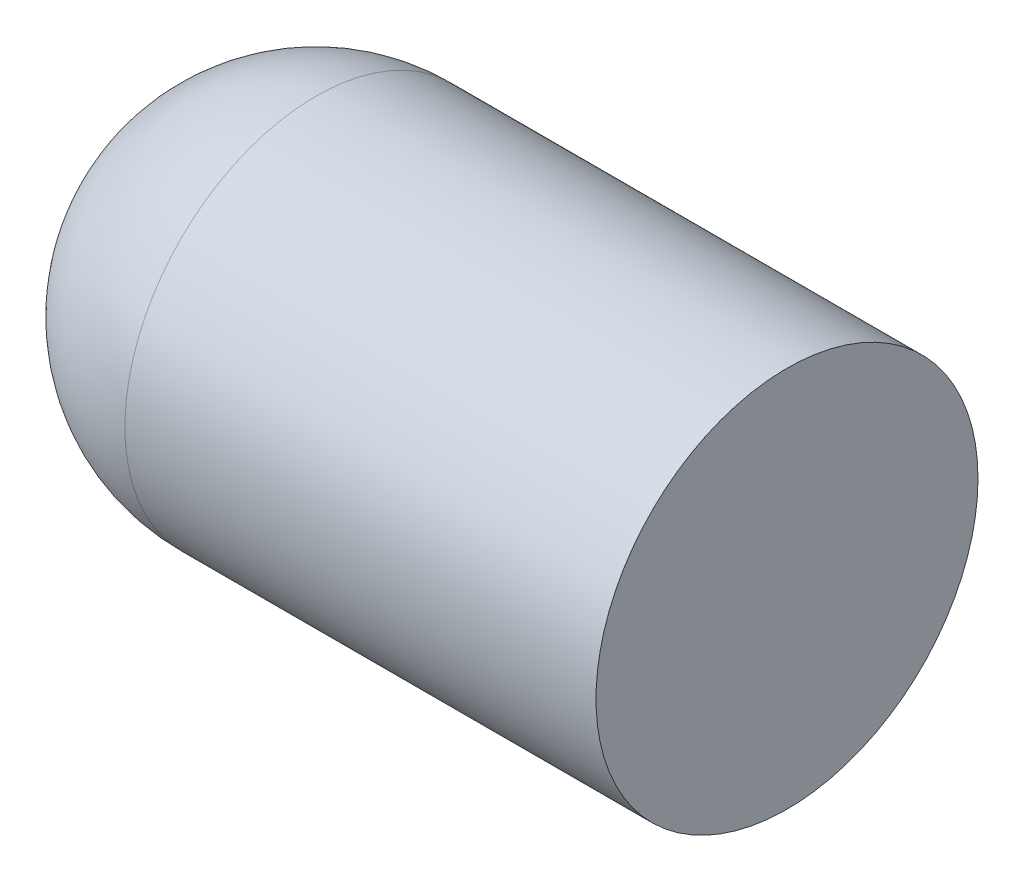
ISO-10303-21;
HEADER;
FILE_DESCRIPTION(('STEP AP214'),'2;1');
FILE_NAME('part.step','',(''),(''),'','','');
FILE_SCHEMA(('AUTOMOTIVE_DESIGN { 1 0 10303 214 1 1 1 1 }'));
ENDSEC;
DATA;
#1=APPLICATION_CONTEXT('core data for automotive mechanical design processes');
#2=APPLICATION_PROTOCOL_DEFINITION('international standard','automotive_design',2000,#1);
#3=PRODUCT_CONTEXT('',#1,'mechanical');
#4=PRODUCT('Part','Part','',(#3));
#5=PRODUCT_RELATED_PRODUCT_CATEGORY('part','',(#4));
#6=PRODUCT_DEFINITION_FORMATION('','',#4);
#7=PRODUCT_DEFINITION_CONTEXT('part definition',#1,'design');
#8=PRODUCT_DEFINITION('design','',#6,#7);
#9=PRODUCT_DEFINITION_SHAPE('','',#8);
#10=(LENGTH_UNIT() NAMED_UNIT(*) SI_UNIT(.MILLI.,.METRE.));
#11=(NAMED_UNIT(*) PLANE_ANGLE_UNIT() SI_UNIT($,.RADIAN.));
#12=(NAMED_UNIT(*) SI_UNIT($,.STERADIAN.) SOLID_ANGLE_UNIT());
#13=UNCERTAINTY_MEASURE_WITH_UNIT(LENGTH_MEASURE(1.E-05),#10,'distance_accuracy_value','');
#14=(GEOMETRIC_REPRESENTATION_CONTEXT(3) GLOBAL_UNCERTAINTY_ASSIGNED_CONTEXT((#13)) GLOBAL_UNIT_ASSIGNED_CONTEXT((#10,
#11,#12)) REPRESENTATION_CONTEXT('',''));
#15=CARTESIAN_POINT('',(0.,0.,0.));
#16=DIRECTION('',(0.,0.,1.));
#17=DIRECTION('',(1.,0.,0.));
#18=AXIS2_PLACEMENT_3D('',#15,#16,#17);
#19=CARTESIAN_POINT('',(3.7,0.,0.));
#20=DIRECTION('',(-1.,0.,0.));
#21=DIRECTION('',(0.,0.,1.));
#22=AXIS2_PLACEMENT_3D('',#19,#20,#21);
#23=CYLINDRICAL_SURFACE('',#22,1.5);
#24=CARTESIAN_POINT('',(3.7,0.,0.));
#25=DIRECTION('',(1.,0.,0.));
#26=DIRECTION('',(0.,0.,-1.));
#27=AXIS2_PLACEMENT_3D('',#24,#25,#26);
#28=CIRCLE('',#27,1.5);
#29=CARTESIAN_POINT('',(3.7,0.,-1.5));
#30=VERTEX_POINT('',#29);
#31=EDGE_CURVE('E10',#30,#30,#28,.T.);
#32=ORIENTED_EDGE('',*,*,#31,.F.);
#33=EDGE_LOOP('',(#32));
#34=FACE_BOUND('',#33,.T.);
#35=CARTESIAN_POINT('',(0.,0.,0.));
#36=DIRECTION('',(1.,0.,0.));
#37=DIRECTION('',(0.,0.,-1.));
#38=AXIS2_PLACEMENT_3D('',#35,#36,#37);
#39=CIRCLE('',#38,1.5);
#40=CARTESIAN_POINT('',(0.,0.,-1.5));
#41=VERTEX_POINT('',#40);
#42=EDGE_CURVE('E41',#41,#41,#39,.T.);
#43=ORIENTED_EDGE('',*,*,#42,.T.);
#44=EDGE_LOOP('',(#43));
#45=FACE_BOUND('',#44,.T.);
#46=ADVANCED_FACE('F37',(#34,#45),#23,.T.);
#47=CARTESIAN_POINT('',(3.7,0.,0.));
#48=DIRECTION('',(1.,0.,0.));
#49=DIRECTION('',(0.,0.,-1.));
#50=AXIS2_PLACEMENT_3D('',#47,#48,#49);
#51=PLANE('',#50);
#52=ORIENTED_EDGE('',*,*,#31,.T.);
#53=EDGE_LOOP('',(#52));
#54=FACE_BOUND('',#53,.T.);
#55=ADVANCED_FACE('F54',(#54),#51,.T.);
#56=CARTESIAN_POINT('',(0.,0.,0.));
#57=DIRECTION('',(0.,-1.,0.));
#58=DIRECTION('',(0.,0.,-1.));
#59=AXIS2_PLACEMENT_3D('',#56,#57,#58);
#60=SPHERICAL_SURFACE('',#59,1.5);
#61=CARTESIAN_POINT('',(0.,0.,0.));
#62=DIRECTION('',(1.,0.,0.));
#63=DIRECTION('',(0.,0.,-1.));
#64=AXIS2_PLACEMENT_3D('',#61,#62,#63);
#65=SPHERICAL_SURFACE('',#64,1.5);
#66=ORIENTED_EDGE('',*,*,#42,.F.);
#67=EDGE_LOOP('',(#66));
#68=FACE_BOUND('',#67,.T.);
#69=ADVANCED_FACE('F39',(#68),#65,.T.);
#70=CLOSED_SHELL('',(#46,#55,#69));
#71=MANIFOLD_SOLID_BREP('B2',#70);
#72=ADVANCED_BREP_SHAPE_REPRESENTATION('',(#18,#71),#14);
#73=SHAPE_DEFINITION_REPRESENTATION(#9,#72);
ENDSEC;
END-ISO-10303-21;
